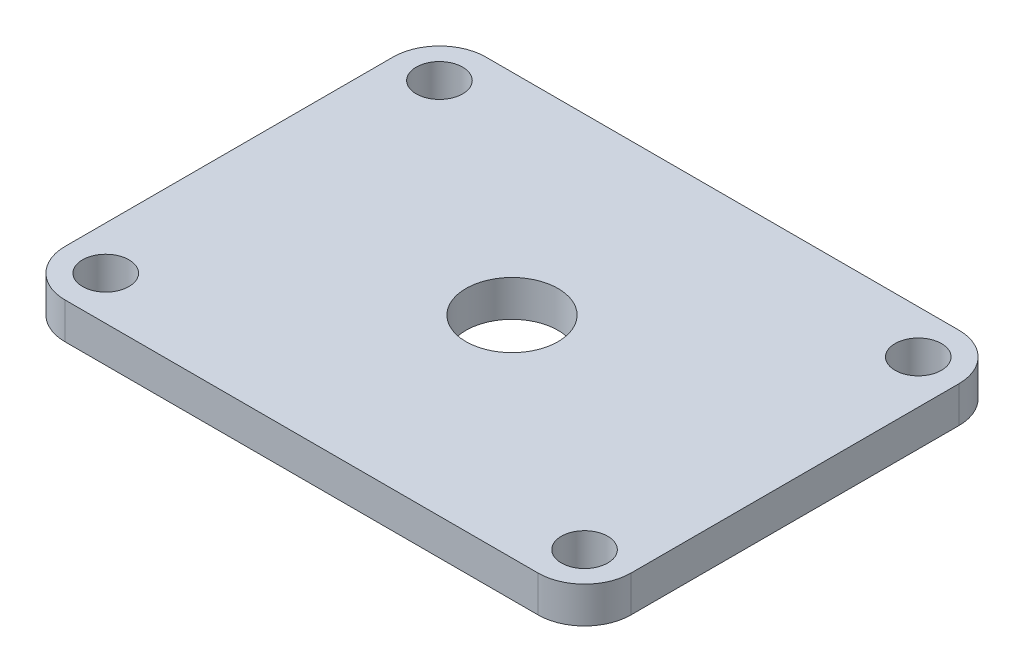
ISO-10303-21;
HEADER;
FILE_DESCRIPTION(('STEP AP214'),'2;1');
FILE_NAME('part.step','',(''),(''),'','','');
FILE_SCHEMA(('AUTOMOTIVE_DESIGN { 1 0 10303 214 1 1 1 1 }'));
ENDSEC;
DATA;
#1=APPLICATION_CONTEXT('core data for automotive mechanical design processes');
#2=APPLICATION_PROTOCOL_DEFINITION('international standard','automotive_design',2000,#1);
#3=PRODUCT_CONTEXT('',#1,'mechanical');
#4=PRODUCT('Part','Part','',(#3));
#5=PRODUCT_RELATED_PRODUCT_CATEGORY('part','',(#4));
#6=PRODUCT_DEFINITION_FORMATION('','',#4);
#7=PRODUCT_DEFINITION_CONTEXT('part definition',#1,'design');
#8=PRODUCT_DEFINITION('design','',#6,#7);
#9=PRODUCT_DEFINITION_SHAPE('','',#8);
#10=(LENGTH_UNIT() NAMED_UNIT(*) SI_UNIT(.MILLI.,.METRE.));
#11=(NAMED_UNIT(*) PLANE_ANGLE_UNIT() SI_UNIT($,.RADIAN.));
#12=(NAMED_UNIT(*) SI_UNIT($,.STERADIAN.) SOLID_ANGLE_UNIT());
#13=UNCERTAINTY_MEASURE_WITH_UNIT(LENGTH_MEASURE(1.E-05),#10,'distance_accuracy_value','');
#14=(GEOMETRIC_REPRESENTATION_CONTEXT(3) GLOBAL_UNCERTAINTY_ASSIGNED_CONTEXT((#13)) GLOBAL_UNIT_ASSIGNED_CONTEXT((#10,
#11,#12)) REPRESENTATION_CONTEXT('',''));
#15=CARTESIAN_POINT('',(0.,0.,0.));
#16=DIRECTION('',(0.,0.,1.));
#17=DIRECTION('',(1.,0.,0.));
#18=AXIS2_PLACEMENT_3D('',#15,#16,#17);
#19=CARTESIAN_POINT('',(3.2,2.5,-3.2));
#20=DIRECTION('',(0.,-1.,0.));
#21=DIRECTION('',(0.,0.,-1.));
#22=AXIS2_PLACEMENT_3D('',#19,#20,#21);
#23=PLANE('',#22);
#24=CARTESIAN_POINT('',(3.2,2.5,-3.2));
#25=DIRECTION('',(0.,1.,0.));
#26=DIRECTION('',(0.,0.,-1.));
#27=AXIS2_PLACEMENT_3D('',#24,#25,#26);
#28=CIRCLE('',#27,3.2);
#29=CARTESIAN_POINT('',(0.,2.5,-3.20000000000002));
#30=VERTEX_POINT('',#29);
#31=CARTESIAN_POINT('',(3.20000000000002,2.5,0.));
#32=VERTEX_POINT('',#31);
#33=EDGE_CURVE('E164',#30,#32,#28,.T.);
#34=ORIENTED_EDGE('',*,*,#33,.T.);
#35=DIRECTION('',(1.,0.,0.));
#36=VECTOR('',#35,1.);
#37=CARTESIAN_POINT('',(3.20000000000002,2.5,0.));
#38=LINE('',#37,#36);
#39=CARTESIAN_POINT('',(35.8,2.5,0.));
#40=VERTEX_POINT('',#39);
#41=EDGE_CURVE('E100',#32,#40,#38,.T.);
#42=ORIENTED_EDGE('',*,*,#41,.T.);
#43=CARTESIAN_POINT('',(35.8,2.5,-3.2));
#44=DIRECTION('',(0.,1.,0.));
#45=DIRECTION('',(0.,0.,1.));
#46=AXIS2_PLACEMENT_3D('',#43,#44,#45);
#47=CIRCLE('',#46,3.2);
#48=CARTESIAN_POINT('',(39.,2.5,-3.20000000000002));
#49=VERTEX_POINT('',#48);
#50=EDGE_CURVE('E185',#40,#49,#47,.T.);
#51=ORIENTED_EDGE('',*,*,#50,.T.);
#52=DIRECTION('',(0.,0.,-1.));
#53=VECTOR('',#52,1.);
#54=CARTESIAN_POINT('',(39.,2.5,-3.20000000000002));
#55=LINE('',#54,#53);
#56=CARTESIAN_POINT('',(39.,2.5,-25.8));
#57=VERTEX_POINT('',#56);
#58=EDGE_CURVE('E199',#49,#57,#55,.T.);
#59=ORIENTED_EDGE('',*,*,#58,.T.);
#60=CARTESIAN_POINT('',(35.8,2.5,-25.8));
#61=DIRECTION('',(0.,1.,0.));
#62=DIRECTION('',(0.,0.,-1.));
#63=AXIS2_PLACEMENT_3D('',#60,#61,#62);
#64=CIRCLE('',#63,3.2);
#65=CARTESIAN_POINT('',(35.8,2.5,-29.));
#66=VERTEX_POINT('',#65);
#67=EDGE_CURVE('E119',#57,#66,#64,.T.);
#68=ORIENTED_EDGE('',*,*,#67,.T.);
#69=DIRECTION('',(-1.,0.,0.));
#70=VECTOR('',#69,1.);
#71=CARTESIAN_POINT('',(3.20000000000002,2.5,-29.));
#72=LINE('',#71,#70);
#73=CARTESIAN_POINT('',(3.20000000000002,2.5,-29.));
#74=VERTEX_POINT('',#73);
#75=EDGE_CURVE('E113',#66,#74,#72,.T.);
#76=ORIENTED_EDGE('',*,*,#75,.T.);
#77=CARTESIAN_POINT('',(3.2,2.5,-25.8));
#78=DIRECTION('',(0.,1.,0.));
#79=DIRECTION('',(0.,0.,-1.));
#80=AXIS2_PLACEMENT_3D('',#77,#78,#79);
#81=CIRCLE('',#80,3.2);
#82=CARTESIAN_POINT('',(0.,2.5,-25.8));
#83=VERTEX_POINT('',#82);
#84=EDGE_CURVE('E117',#74,#83,#81,.T.);
#85=ORIENTED_EDGE('',*,*,#84,.T.);
#86=DIRECTION('',(0.,0.,1.));
#87=VECTOR('',#86,1.);
#88=CARTESIAN_POINT('',(0.,2.5,-3.20000000000002));
#89=LINE('',#88,#87);
#90=EDGE_CURVE('E57',#83,#30,#89,.T.);
#91=ORIENTED_EDGE('',*,*,#90,.T.);
#92=EDGE_LOOP('',(#34,#42,#51,#59,#68,#76,#85,#91));
#93=FACE_BOUND('',#92,.T.);
#94=CARTESIAN_POINT('',(19.5,2.5,-14.5));
#95=DIRECTION('',(0.,1.,0.));
#96=DIRECTION('',(0.,0.,1.));
#97=AXIS2_PLACEMENT_3D('',#94,#95,#96);
#98=CIRCLE('',#97,3.175);
#99=CARTESIAN_POINT('',(19.5,2.5,-11.325));
#100=VERTEX_POINT('',#99);
#101=EDGE_CURVE('E146',#100,#100,#98,.T.);
#102=ORIENTED_EDGE('',*,*,#101,.F.);
#103=EDGE_LOOP('',(#102));
#104=FACE_BOUND('',#103,.T.);
#105=CARTESIAN_POINT('',(3.,2.5,-26.));
#106=DIRECTION('',(0.,1.,0.));
#107=DIRECTION('',(0.,0.,1.));
#108=AXIS2_PLACEMENT_3D('',#105,#106,#107);
#109=CIRCLE('',#108,1.6);
#110=CARTESIAN_POINT('',(3.,2.5,-24.4));
#111=VERTEX_POINT('',#110);
#112=EDGE_CURVE('E213',#111,#111,#109,.T.);
#113=ORIENTED_EDGE('',*,*,#112,.F.);
#114=EDGE_LOOP('',(#113));
#115=FACE_BOUND('',#114,.T.);
#116=CARTESIAN_POINT('',(36.,2.5,-26.));
#117=DIRECTION('',(0.,1.,0.));
#118=DIRECTION('',(0.,0.,1.));
#119=AXIS2_PLACEMENT_3D('',#116,#117,#118);
#120=CIRCLE('',#119,1.6);
#121=CARTESIAN_POINT('',(36.,2.5,-24.4));
#122=VERTEX_POINT('',#121);
#123=EDGE_CURVE('E221',#122,#122,#120,.T.);
#124=ORIENTED_EDGE('',*,*,#123,.F.);
#125=EDGE_LOOP('',(#124));
#126=FACE_BOUND('',#125,.T.);
#127=CARTESIAN_POINT('',(36.,2.5,-3.));
#128=DIRECTION('',(0.,1.,0.));
#129=DIRECTION('',(0.,0.,1.));
#130=AXIS2_PLACEMENT_3D('',#127,#128,#129);
#131=CIRCLE('',#130,1.6);
#132=CARTESIAN_POINT('',(36.,2.5,-1.4));
#133=VERTEX_POINT('',#132);
#134=EDGE_CURVE('E229',#133,#133,#131,.T.);
#135=ORIENTED_EDGE('',*,*,#134,.F.);
#136=EDGE_LOOP('',(#135));
#137=FACE_BOUND('',#136,.T.);
#138=CARTESIAN_POINT('',(3.,2.5,-3.));
#139=DIRECTION('',(0.,1.,0.));
#140=DIRECTION('',(0.,0.,1.));
#141=AXIS2_PLACEMENT_3D('',#138,#139,#140);
#142=CIRCLE('',#141,1.6);
#143=CARTESIAN_POINT('',(3.,2.5,-1.4));
#144=VERTEX_POINT('',#143);
#145=EDGE_CURVE('E237',#144,#144,#142,.T.);
#146=ORIENTED_EDGE('',*,*,#145,.F.);
#147=EDGE_LOOP('',(#146));
#148=FACE_BOUND('',#147,.T.);
#149=ADVANCED_FACE('F39',(#93,#104,#115,#126,#137,#148),#23,.F.);
#150=CARTESIAN_POINT('',(3.2,0.,-3.2));
#151=DIRECTION('',(0.,-1.,0.));
#152=DIRECTION('',(0.,0.,-1.));
#153=AXIS2_PLACEMENT_3D('',#150,#151,#152);
#154=PLANE('',#153);
#155=CARTESIAN_POINT('',(36.,0.,-3.));
#156=DIRECTION('',(0.,1.,0.));
#157=DIRECTION('',(0.,0.,1.));
#158=AXIS2_PLACEMENT_3D('',#155,#156,#157);
#159=CIRCLE('',#158,1.6);
#160=CARTESIAN_POINT('',(36.,0.,-1.4));
#161=VERTEX_POINT('',#160);
#162=EDGE_CURVE('E233',#161,#161,#159,.T.);
#163=ORIENTED_EDGE('',*,*,#162,.T.);
#164=EDGE_LOOP('',(#163));
#165=FACE_BOUND('',#164,.T.);
#166=CARTESIAN_POINT('',(3.,0.,-26.));
#167=DIRECTION('',(0.,1.,0.));
#168=DIRECTION('',(0.,0.,1.));
#169=AXIS2_PLACEMENT_3D('',#166,#167,#168);
#170=CIRCLE('',#169,1.6);
#171=CARTESIAN_POINT('',(3.,0.,-24.4));
#172=VERTEX_POINT('',#171);
#173=EDGE_CURVE('E217',#172,#172,#170,.T.);
#174=ORIENTED_EDGE('',*,*,#173,.T.);
#175=EDGE_LOOP('',(#174));
#176=FACE_BOUND('',#175,.T.);
#177=CARTESIAN_POINT('',(3.2,0.,-3.2));
#178=DIRECTION('',(0.,1.,0.));
#179=DIRECTION('',(0.,0.,-1.));
#180=AXIS2_PLACEMENT_3D('',#177,#178,#179);
#181=CIRCLE('',#180,3.2);
#182=CARTESIAN_POINT('',(0.,0.,-3.20000000000002));
#183=VERTEX_POINT('',#182);
#184=CARTESIAN_POINT('',(3.20000000000002,0.,0.));
#185=VERTEX_POINT('',#184);
#186=EDGE_CURVE('E141',#183,#185,#181,.T.);
#187=ORIENTED_EDGE('',*,*,#186,.F.);
#188=DIRECTION('',(0.,0.,1.));
#189=VECTOR('',#188,1.);
#190=CARTESIAN_POINT('',(0.,0.,-3.20000000000002));
#191=LINE('',#190,#189);
#192=CARTESIAN_POINT('',(0.,0.,-25.8));
#193=VERTEX_POINT('',#192);
#194=EDGE_CURVE('E92',#193,#183,#191,.T.);
#195=ORIENTED_EDGE('',*,*,#194,.F.);
#196=CARTESIAN_POINT('',(3.2,0.,-25.8));
#197=DIRECTION('',(0.,1.,0.));
#198=DIRECTION('',(0.,0.,-1.));
#199=AXIS2_PLACEMENT_3D('',#196,#197,#198);
#200=CIRCLE('',#199,3.2);
#201=CARTESIAN_POINT('',(3.20000000000002,0.,-29.));
#202=VERTEX_POINT('',#201);
#203=EDGE_CURVE('E86',#202,#193,#200,.T.);
#204=ORIENTED_EDGE('',*,*,#203,.F.);
#205=DIRECTION('',(-1.,0.,0.));
#206=VECTOR('',#205,1.);
#207=CARTESIAN_POINT('',(3.20000000000002,0.,-29.));
#208=LINE('',#207,#206);
#209=CARTESIAN_POINT('',(35.8,0.,-29.));
#210=VERTEX_POINT('',#209);
#211=EDGE_CURVE('E128',#210,#202,#208,.T.);
#212=ORIENTED_EDGE('',*,*,#211,.F.);
#213=CARTESIAN_POINT('',(35.8,0.,-25.8));
#214=DIRECTION('',(0.,1.,0.));
#215=DIRECTION('',(0.,0.,-1.));
#216=AXIS2_PLACEMENT_3D('',#213,#214,#215);
#217=CIRCLE('',#216,3.2);
#218=CARTESIAN_POINT('',(39.,0.,-25.8));
#219=VERTEX_POINT('',#218);
#220=EDGE_CURVE('E155',#219,#210,#217,.T.);
#221=ORIENTED_EDGE('',*,*,#220,.F.);
#222=DIRECTION('',(0.,0.,-1.));
#223=VECTOR('',#222,1.);
#224=CARTESIAN_POINT('',(39.,0.,-3.20000000000002));
#225=LINE('',#224,#223);
#226=CARTESIAN_POINT('',(39.,0.,-3.20000000000002));
#227=VERTEX_POINT('',#226);
#228=EDGE_CURVE('E152',#227,#219,#225,.T.);
#229=ORIENTED_EDGE('',*,*,#228,.F.);
#230=CARTESIAN_POINT('',(35.8,0.,-3.2));
#231=DIRECTION('',(0.,1.,0.));
#232=DIRECTION('',(0.,0.,1.));
#233=AXIS2_PLACEMENT_3D('',#230,#231,#232);
#234=CIRCLE('',#233,3.2);
#235=CARTESIAN_POINT('',(35.8,0.,0.));
#236=VERTEX_POINT('',#235);
#237=EDGE_CURVE('E149',#236,#227,#234,.T.);
#238=ORIENTED_EDGE('',*,*,#237,.F.);
#239=DIRECTION('',(1.,0.,0.));
#240=VECTOR('',#239,1.);
#241=CARTESIAN_POINT('',(3.20000000000002,0.,0.));
#242=LINE('',#241,#240);
#243=EDGE_CURVE('E145',#185,#236,#242,.T.);
#244=ORIENTED_EDGE('',*,*,#243,.F.);
#245=EDGE_LOOP('',(#187,#195,#204,#212,#221,#229,#238,#244));
#246=FACE_BOUND('',#245,.T.);
#247=CARTESIAN_POINT('',(19.5,0.,-14.5));
#248=DIRECTION('',(0.,1.,0.));
#249=DIRECTION('',(0.,0.,1.));
#250=AXIS2_PLACEMENT_3D('',#247,#248,#249);
#251=CIRCLE('',#250,3.175);
#252=CARTESIAN_POINT('',(19.5,0.,-11.325));
#253=VERTEX_POINT('',#252);
#254=EDGE_CURVE('E209',#253,#253,#251,.T.);
#255=ORIENTED_EDGE('',*,*,#254,.T.);
#256=EDGE_LOOP('',(#255));
#257=FACE_BOUND('',#256,.T.);
#258=CARTESIAN_POINT('',(36.,0.,-26.));
#259=DIRECTION('',(0.,1.,0.));
#260=DIRECTION('',(0.,0.,1.));
#261=AXIS2_PLACEMENT_3D('',#258,#259,#260);
#262=CIRCLE('',#261,1.6);
#263=CARTESIAN_POINT('',(36.,0.,-24.4));
#264=VERTEX_POINT('',#263);
#265=EDGE_CURVE('E225',#264,#264,#262,.T.);
#266=ORIENTED_EDGE('',*,*,#265,.T.);
#267=EDGE_LOOP('',(#266));
#268=FACE_BOUND('',#267,.T.);
#269=CARTESIAN_POINT('',(3.,0.,-3.));
#270=DIRECTION('',(0.,1.,0.));
#271=DIRECTION('',(0.,0.,1.));
#272=AXIS2_PLACEMENT_3D('',#269,#270,#271);
#273=CIRCLE('',#272,1.6);
#274=CARTESIAN_POINT('',(3.,0.,-1.4));
#275=VERTEX_POINT('',#274);
#276=EDGE_CURVE('E241',#275,#275,#273,.T.);
#277=ORIENTED_EDGE('',*,*,#276,.T.);
#278=EDGE_LOOP('',(#277));
#279=FACE_BOUND('',#278,.T.);
#280=ADVANCED_FACE('F189',(#165,#176,#246,#257,#268,#279),#154,.T.);
#281=CARTESIAN_POINT('',(3.2,2.5,-3.2));
#282=DIRECTION('',(0.,-1.,0.));
#283=DIRECTION('',(0.,0.,-1.));
#284=AXIS2_PLACEMENT_3D('',#281,#282,#283);
#285=CYLINDRICAL_SURFACE('',#284,3.2);
#286=ORIENTED_EDGE('',*,*,#186,.T.);
#287=DIRECTION('',(0.,-1.,0.));
#288=VECTOR('',#287,1.);
#289=CARTESIAN_POINT('',(3.20000000000002,2.5,0.));
#290=LINE('',#289,#288);
#291=EDGE_CURVE('E11',#32,#185,#290,.T.);
#292=ORIENTED_EDGE('',*,*,#291,.F.);
#293=ORIENTED_EDGE('',*,*,#33,.F.);
#294=DIRECTION('',(0.,-1.,0.));
#295=VECTOR('',#294,1.);
#296=CARTESIAN_POINT('',(0.,2.5,-3.20000000000002));
#297=LINE('',#296,#295);
#298=EDGE_CURVE('E137',#30,#183,#297,.T.);
#299=ORIENTED_EDGE('',*,*,#298,.T.);
#300=EDGE_LOOP('',(#286,#292,#293,#299));
#301=FACE_BOUND('',#300,.T.);
#302=ADVANCED_FACE('F41',(#301),#285,.T.);
#303=CARTESIAN_POINT('',(3.20000000000002,2.5,0.));
#304=DIRECTION('',(0.,0.,-1.));
#305=DIRECTION('',(-1.,0.,0.));
#306=AXIS2_PLACEMENT_3D('',#303,#304,#305);
#307=PLANE('',#306);
#308=ORIENTED_EDGE('',*,*,#243,.T.);
#309=DIRECTION('',(0.,-1.,0.));
#310=VECTOR('',#309,1.);
#311=CARTESIAN_POINT('',(35.8,2.5,0.));
#312=LINE('',#311,#310);
#313=EDGE_CURVE('E49',#40,#236,#312,.T.);
#314=ORIENTED_EDGE('',*,*,#313,.F.);
#315=ORIENTED_EDGE('',*,*,#41,.F.);
#316=ORIENTED_EDGE('',*,*,#291,.T.);
#317=EDGE_LOOP('',(#308,#314,#315,#316));
#318=FACE_BOUND('',#317,.T.);
#319=ADVANCED_FACE('F275',(#318),#307,.F.);
#320=CARTESIAN_POINT('',(35.8,2.5,-3.2));
#321=DIRECTION('',(0.,-1.,0.));
#322=DIRECTION('',(0.,0.,-1.));
#323=AXIS2_PLACEMENT_3D('',#320,#321,#322);
#324=CYLINDRICAL_SURFACE('',#323,3.2);
#325=ORIENTED_EDGE('',*,*,#237,.T.);
#326=DIRECTION('',(0.,-1.,0.));
#327=VECTOR('',#326,1.);
#328=CARTESIAN_POINT('',(39.,2.5,-3.20000000000002));
#329=LINE('',#328,#327);
#330=EDGE_CURVE('E175',#49,#227,#329,.T.);
#331=ORIENTED_EDGE('',*,*,#330,.F.);
#332=ORIENTED_EDGE('',*,*,#50,.F.);
#333=ORIENTED_EDGE('',*,*,#313,.T.);
#334=EDGE_LOOP('',(#325,#331,#332,#333));
#335=FACE_BOUND('',#334,.T.);
#336=ADVANCED_FACE('F183',(#335),#324,.T.);
#337=CARTESIAN_POINT('',(39.,2.5,-3.20000000000002));
#338=DIRECTION('',(-1.,0.,0.));
#339=DIRECTION('',(0.,0.,1.));
#340=AXIS2_PLACEMENT_3D('',#337,#338,#339);
#341=PLANE('',#340);
#342=ORIENTED_EDGE('',*,*,#228,.T.);
#343=DIRECTION('',(0.,-1.,0.));
#344=VECTOR('',#343,1.);
#345=CARTESIAN_POINT('',(39.,2.5,-25.8));
#346=LINE('',#345,#344);
#347=EDGE_CURVE('E171',#57,#219,#346,.T.);
#348=ORIENTED_EDGE('',*,*,#347,.F.);
#349=ORIENTED_EDGE('',*,*,#58,.F.);
#350=ORIENTED_EDGE('',*,*,#330,.T.);
#351=EDGE_LOOP('',(#342,#348,#349,#350));
#352=FACE_BOUND('',#351,.T.);
#353=ADVANCED_FACE('F194',(#352),#341,.F.);
#354=CARTESIAN_POINT('',(35.8,2.5,-25.8));
#355=DIRECTION('',(0.,-1.,0.));
#356=DIRECTION('',(0.,0.,-1.));
#357=AXIS2_PLACEMENT_3D('',#354,#355,#356);
#358=CYLINDRICAL_SURFACE('',#357,3.2);
#359=ORIENTED_EDGE('',*,*,#220,.T.);
#360=DIRECTION('',(0.,-1.,0.));
#361=VECTOR('',#360,1.);
#362=CARTESIAN_POINT('',(35.8,2.5,-29.));
#363=LINE('',#362,#361);
#364=EDGE_CURVE('E130',#66,#210,#363,.T.);
#365=ORIENTED_EDGE('',*,*,#364,.F.);
#366=ORIENTED_EDGE('',*,*,#67,.F.);
#367=ORIENTED_EDGE('',*,*,#347,.T.);
#368=EDGE_LOOP('',(#359,#365,#366,#367));
#369=FACE_BOUND('',#368,.T.);
#370=ADVANCED_FACE('F197',(#369),#358,.T.);
#371=CARTESIAN_POINT('',(3.20000000000002,2.5,-29.));
#372=DIRECTION('',(0.,0.,1.));
#373=DIRECTION('',(1.,0.,0.));
#374=AXIS2_PLACEMENT_3D('',#371,#372,#373);
#375=PLANE('',#374);
#376=ORIENTED_EDGE('',*,*,#211,.T.);
#377=DIRECTION('',(0.,-1.,0.));
#378=VECTOR('',#377,1.);
#379=CARTESIAN_POINT('',(3.20000000000002,2.5,-29.));
#380=LINE('',#379,#378);
#381=EDGE_CURVE('E125',#74,#202,#380,.T.);
#382=ORIENTED_EDGE('',*,*,#381,.F.);
#383=ORIENTED_EDGE('',*,*,#75,.F.);
#384=ORIENTED_EDGE('',*,*,#364,.T.);
#385=EDGE_LOOP('',(#376,#382,#383,#384));
#386=FACE_BOUND('',#385,.T.);
#387=ADVANCED_FACE('F126',(#386),#375,.F.);
#388=CARTESIAN_POINT('',(3.2,2.5,-25.8));
#389=DIRECTION('',(0.,-1.,0.));
#390=DIRECTION('',(0.,0.,-1.));
#391=AXIS2_PLACEMENT_3D('',#388,#389,#390);
#392=CYLINDRICAL_SURFACE('',#391,3.2);
#393=ORIENTED_EDGE('',*,*,#203,.T.);
#394=DIRECTION('',(0.,-1.,0.));
#395=VECTOR('',#394,1.);
#396=CARTESIAN_POINT('',(0.,2.5,-25.8));
#397=LINE('',#396,#395);
#398=EDGE_CURVE('E131',#83,#193,#397,.T.);
#399=ORIENTED_EDGE('',*,*,#398,.F.);
#400=ORIENTED_EDGE('',*,*,#84,.F.);
#401=ORIENTED_EDGE('',*,*,#381,.T.);
#402=EDGE_LOOP('',(#393,#399,#400,#401));
#403=FACE_BOUND('',#402,.T.);
#404=ADVANCED_FACE('F133',(#403),#392,.T.);
#405=CARTESIAN_POINT('',(0.,2.5,-3.20000000000002));
#406=DIRECTION('',(1.,0.,0.));
#407=DIRECTION('',(0.,0.,-1.));
#408=AXIS2_PLACEMENT_3D('',#405,#406,#407);
#409=PLANE('',#408);
#410=ORIENTED_EDGE('',*,*,#194,.T.);
#411=ORIENTED_EDGE('',*,*,#298,.F.);
#412=ORIENTED_EDGE('',*,*,#90,.F.);
#413=ORIENTED_EDGE('',*,*,#398,.T.);
#414=EDGE_LOOP('',(#410,#411,#412,#413));
#415=FACE_BOUND('',#414,.T.);
#416=ADVANCED_FACE('F263',(#415),#409,.F.);
#417=CARTESIAN_POINT('',(19.5,2.5,-14.5));
#418=DIRECTION('',(0.,-1.,0.));
#419=DIRECTION('',(0.,0.,-1.));
#420=AXIS2_PLACEMENT_3D('',#417,#418,#419);
#421=CYLINDRICAL_SURFACE('',#420,3.175);
#422=ORIENTED_EDGE('',*,*,#101,.T.);
#423=EDGE_LOOP('',(#422));
#424=FACE_BOUND('',#423,.T.);
#425=ORIENTED_EDGE('',*,*,#254,.F.);
#426=EDGE_LOOP('',(#425));
#427=FACE_BOUND('',#426,.T.);
#428=ADVANCED_FACE('F260',(#424,#427),#421,.F.);
#429=CARTESIAN_POINT('',(3.,2.5,-26.));
#430=DIRECTION('',(0.,-1.,0.));
#431=DIRECTION('',(0.,0.,-1.));
#432=AXIS2_PLACEMENT_3D('',#429,#430,#431);
#433=CYLINDRICAL_SURFACE('',#432,1.6);
#434=ORIENTED_EDGE('',*,*,#112,.T.);
#435=EDGE_LOOP('',(#434));
#436=FACE_BOUND('',#435,.T.);
#437=ORIENTED_EDGE('',*,*,#173,.F.);
#438=EDGE_LOOP('',(#437));
#439=FACE_BOUND('',#438,.T.);
#440=ADVANCED_FACE('F339',(#436,#439),#433,.F.);
#441=CARTESIAN_POINT('',(36.,2.5,-26.));
#442=DIRECTION('',(0.,-1.,0.));
#443=DIRECTION('',(0.,0.,-1.));
#444=AXIS2_PLACEMENT_3D('',#441,#442,#443);
#445=CYLINDRICAL_SURFACE('',#444,1.6);
#446=ORIENTED_EDGE('',*,*,#123,.T.);
#447=EDGE_LOOP('',(#446));
#448=FACE_BOUND('',#447,.T.);
#449=ORIENTED_EDGE('',*,*,#265,.F.);
#450=EDGE_LOOP('',(#449));
#451=FACE_BOUND('',#450,.T.);
#452=ADVANCED_FACE('F347',(#448,#451),#445,.F.);
#453=CARTESIAN_POINT('',(36.,2.5,-3.));
#454=DIRECTION('',(0.,-1.,0.));
#455=DIRECTION('',(0.,0.,-1.));
#456=AXIS2_PLACEMENT_3D('',#453,#454,#455);
#457=CYLINDRICAL_SURFACE('',#456,1.6);
#458=ORIENTED_EDGE('',*,*,#134,.T.);
#459=EDGE_LOOP('',(#458));
#460=FACE_BOUND('',#459,.T.);
#461=ORIENTED_EDGE('',*,*,#162,.F.);
#462=EDGE_LOOP('',(#461));
#463=FACE_BOUND('',#462,.T.);
#464=ADVANCED_FACE('F355',(#460,#463),#457,.F.);
#465=CARTESIAN_POINT('',(3.,2.5,-3.));
#466=DIRECTION('',(0.,-1.,0.));
#467=DIRECTION('',(0.,0.,-1.));
#468=AXIS2_PLACEMENT_3D('',#465,#466,#467);
#469=CYLINDRICAL_SURFACE('',#468,1.6);
#470=ORIENTED_EDGE('',*,*,#145,.T.);
#471=EDGE_LOOP('',(#470));
#472=FACE_BOUND('',#471,.T.);
#473=ORIENTED_EDGE('',*,*,#276,.F.);
#474=EDGE_LOOP('',(#473));
#475=FACE_BOUND('',#474,.T.);
#476=ADVANCED_FACE('F249',(#472,#475),#469,.F.);
#477=CLOSED_SHELL('',(#149,#280,#302,#319,#336,#353,#370,#387,#404,#416,#428,#440,#452,#464,#476));
#478=MANIFOLD_SOLID_BREP('B2',#477);
#479=ADVANCED_BREP_SHAPE_REPRESENTATION('',(#18,#478),#14);
#480=SHAPE_DEFINITION_REPRESENTATION(#9,#479);
ENDSEC;
END-ISO-10303-21;
